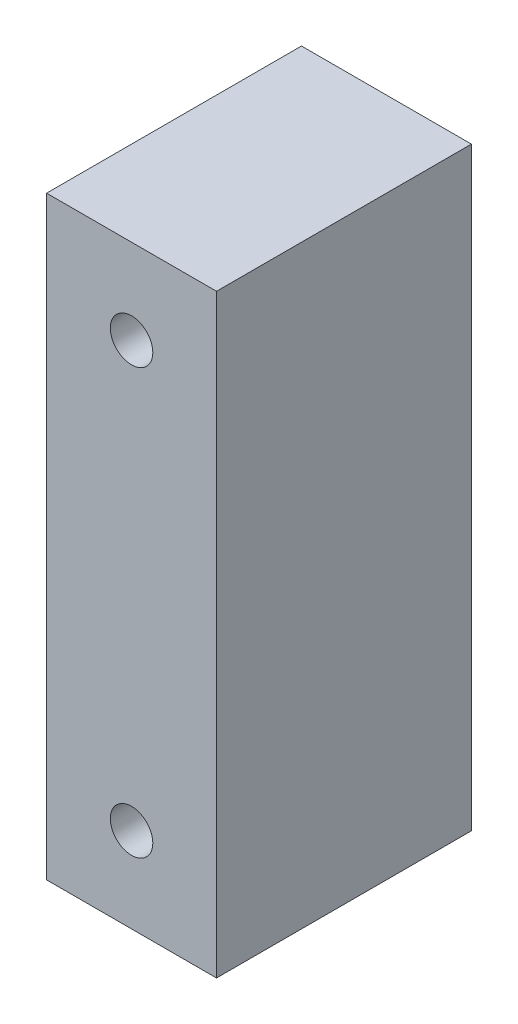
ISO-10303-21;
HEADER;
FILE_DESCRIPTION(('STEP AP214'),'2;1');
FILE_NAME('part.step','',(''),(''),'','','');
FILE_SCHEMA(('AUTOMOTIVE_DESIGN { 1 0 10303 214 1 1 1 1 }'));
ENDSEC;
DATA;
#1=APPLICATION_CONTEXT('core data for automotive mechanical design processes');
#2=APPLICATION_PROTOCOL_DEFINITION('international standard','automotive_design',2000,#1);
#3=PRODUCT_CONTEXT('',#1,'mechanical');
#4=PRODUCT('Part','Part','',(#3));
#5=PRODUCT_RELATED_PRODUCT_CATEGORY('part','',(#4));
#6=PRODUCT_DEFINITION_FORMATION('','',#4);
#7=PRODUCT_DEFINITION_CONTEXT('part definition',#1,'design');
#8=PRODUCT_DEFINITION('design','',#6,#7);
#9=PRODUCT_DEFINITION_SHAPE('','',#8);
#10=(LENGTH_UNIT() NAMED_UNIT(*) SI_UNIT(.MILLI.,.METRE.));
#11=(NAMED_UNIT(*) PLANE_ANGLE_UNIT() SI_UNIT($,.RADIAN.));
#12=(NAMED_UNIT(*) SI_UNIT($,.STERADIAN.) SOLID_ANGLE_UNIT());
#13=UNCERTAINTY_MEASURE_WITH_UNIT(LENGTH_MEASURE(1.E-05),#10,'distance_accuracy_value','');
#14=(GEOMETRIC_REPRESENTATION_CONTEXT(3) GLOBAL_UNCERTAINTY_ASSIGNED_CONTEXT((#13)) GLOBAL_UNIT_ASSIGNED_CONTEXT((#10,
#11,#12)) REPRESENTATION_CONTEXT('',''));
#15=CARTESIAN_POINT('',(0.,0.,0.));
#16=DIRECTION('',(0.,0.,1.));
#17=DIRECTION('',(1.,0.,0.));
#18=AXIS2_PLACEMENT_3D('',#15,#16,#17);
#19=CARTESIAN_POINT('',(-30.,-105.,90.));
#20=DIRECTION('',(1.,0.,0.));
#21=DIRECTION('',(0.,0.,-1.));
#22=AXIS2_PLACEMENT_3D('',#19,#20,#21);
#23=PLANE('',#22);
#24=DIRECTION('',(0.,-1.,0.));
#25=VECTOR('',#24,1.);
#26=CARTESIAN_POINT('',(-30.,-105.,0.));
#27=LINE('',#26,#25);
#28=CARTESIAN_POINT('',(-30.,105.,0.));
#29=VERTEX_POINT('',#28);
#30=CARTESIAN_POINT('',(-30.,-105.,0.));
#31=VERTEX_POINT('',#30);
#32=EDGE_CURVE('E102',#29,#31,#27,.T.);
#33=ORIENTED_EDGE('',*,*,#32,.T.);
#34=DIRECTION('',(0.,0.,-1.));
#35=VECTOR('',#34,1.);
#36=CARTESIAN_POINT('',(-30.,-105.,90.));
#37=LINE('',#36,#35);
#38=CARTESIAN_POINT('',(-30.,-105.,90.));
#39=VERTEX_POINT('',#38);
#40=EDGE_CURVE('E11',#39,#31,#37,.T.);
#41=ORIENTED_EDGE('',*,*,#40,.F.);
#42=DIRECTION('',(0.,-1.,0.));
#43=VECTOR('',#42,1.);
#44=CARTESIAN_POINT('',(-30.,-105.,90.));
#45=LINE('',#44,#43);
#46=CARTESIAN_POINT('',(-30.,105.,90.));
#47=VERTEX_POINT('',#46);
#48=EDGE_CURVE('E90',#47,#39,#45,.T.);
#49=ORIENTED_EDGE('',*,*,#48,.F.);
#50=DIRECTION('',(0.,0.,-1.));
#51=VECTOR('',#50,1.);
#52=CARTESIAN_POINT('',(-30.,105.,90.));
#53=LINE('',#52,#51);
#54=EDGE_CURVE('E98',#47,#29,#53,.T.);
#55=ORIENTED_EDGE('',*,*,#54,.T.);
#56=EDGE_LOOP('',(#33,#41,#49,#55));
#57=FACE_BOUND('',#56,.T.);
#58=ADVANCED_FACE('F39',(#57),#23,.F.);
#59=CARTESIAN_POINT('',(30.,-105.,90.));
#60=DIRECTION('',(0.,1.,0.));
#61=DIRECTION('',(0.,0.,1.));
#62=AXIS2_PLACEMENT_3D('',#59,#60,#61);
#63=PLANE('',#62);
#64=DIRECTION('',(1.,0.,0.));
#65=VECTOR('',#64,1.);
#66=CARTESIAN_POINT('',(30.,-105.,0.));
#67=LINE('',#66,#65);
#68=CARTESIAN_POINT('',(30.,-105.,0.));
#69=VERTEX_POINT('',#68);
#70=EDGE_CURVE('E94',#31,#69,#67,.T.);
#71=ORIENTED_EDGE('',*,*,#70,.T.);
#72=DIRECTION('',(0.,0.,-1.));
#73=VECTOR('',#72,1.);
#74=CARTESIAN_POINT('',(30.,-105.,90.));
#75=LINE('',#74,#73);
#76=CARTESIAN_POINT('',(30.,-105.,90.));
#77=VERTEX_POINT('',#76);
#78=EDGE_CURVE('E47',#77,#69,#75,.T.);
#79=ORIENTED_EDGE('',*,*,#78,.F.);
#80=DIRECTION('',(1.,0.,0.));
#81=VECTOR('',#80,1.);
#82=CARTESIAN_POINT('',(30.,-105.,90.));
#83=LINE('',#82,#81);
#84=EDGE_CURVE('E85',#39,#77,#83,.T.);
#85=ORIENTED_EDGE('',*,*,#84,.F.);
#86=ORIENTED_EDGE('',*,*,#40,.T.);
#87=EDGE_LOOP('',(#71,#79,#85,#86));
#88=FACE_BOUND('',#87,.T.);
#89=ADVANCED_FACE('F93',(#88),#63,.F.);
#90=CARTESIAN_POINT('',(30.,-105.,90.));
#91=DIRECTION('',(-1.,0.,0.));
#92=DIRECTION('',(0.,0.,1.));
#93=AXIS2_PLACEMENT_3D('',#90,#91,#92);
#94=PLANE('',#93);
#95=DIRECTION('',(0.,1.,0.));
#96=VECTOR('',#95,1.);
#97=CARTESIAN_POINT('',(30.,-105.,0.));
#98=LINE('',#97,#96);
#99=CARTESIAN_POINT('',(30.,105.,0.));
#100=VERTEX_POINT('',#99);
#101=EDGE_CURVE('E72',#69,#100,#98,.T.);
#102=ORIENTED_EDGE('',*,*,#101,.T.);
#103=DIRECTION('',(0.,0.,-1.));
#104=VECTOR('',#103,1.);
#105=CARTESIAN_POINT('',(30.,105.,90.));
#106=LINE('',#105,#104);
#107=CARTESIAN_POINT('',(30.,105.,90.));
#108=VERTEX_POINT('',#107);
#109=EDGE_CURVE('E95',#108,#100,#106,.T.);
#110=ORIENTED_EDGE('',*,*,#109,.F.);
#111=DIRECTION('',(0.,1.,0.));
#112=VECTOR('',#111,1.);
#113=CARTESIAN_POINT('',(30.,-105.,90.));
#114=LINE('',#113,#112);
#115=EDGE_CURVE('E88',#77,#108,#114,.T.);
#116=ORIENTED_EDGE('',*,*,#115,.F.);
#117=ORIENTED_EDGE('',*,*,#78,.T.);
#118=EDGE_LOOP('',(#102,#110,#116,#117));
#119=FACE_BOUND('',#118,.T.);
#120=ADVANCED_FACE('F96',(#119),#94,.F.);
#121=CARTESIAN_POINT('',(30.,105.,90.));
#122=DIRECTION('',(0.,-1.,0.));
#123=DIRECTION('',(1.,0.,0.));
#124=AXIS2_PLACEMENT_3D('',#121,#122,#123);
#125=PLANE('',#124);
#126=DIRECTION('',(-1.,0.,0.));
#127=VECTOR('',#126,1.);
#128=CARTESIAN_POINT('',(30.,105.,0.));
#129=LINE('',#128,#127);
#130=EDGE_CURVE('E78',#100,#29,#129,.T.);
#131=ORIENTED_EDGE('',*,*,#130,.T.);
#132=ORIENTED_EDGE('',*,*,#54,.F.);
#133=DIRECTION('',(-1.,0.,0.));
#134=VECTOR('',#133,1.);
#135=CARTESIAN_POINT('',(30.,105.,90.));
#136=LINE('',#135,#134);
#137=EDGE_CURVE('E55',#108,#47,#136,.T.);
#138=ORIENTED_EDGE('',*,*,#137,.F.);
#139=ORIENTED_EDGE('',*,*,#109,.T.);
#140=EDGE_LOOP('',(#131,#132,#138,#139));
#141=FACE_BOUND('',#140,.T.);
#142=ADVANCED_FACE('F110',(#141),#125,.F.);
#143=CARTESIAN_POINT('',(0.,0.,90.));
#144=DIRECTION('',(0.,0.,1.));
#145=DIRECTION('',(1.,0.,0.));
#146=AXIS2_PLACEMENT_3D('',#143,#144,#145);
#147=PLANE('',#146);
#148=CARTESIAN_POINT('',(0.,75.,90.));
#149=DIRECTION('',(0.,0.,1.));
#150=DIRECTION('',(1.,0.,0.));
#151=AXIS2_PLACEMENT_3D('',#148,#149,#150);
#152=CIRCLE('',#151,7.5);
#153=CARTESIAN_POINT('',(7.5,75.,90.));
#154=VERTEX_POINT('',#153);
#155=EDGE_CURVE('E119',#154,#154,#152,.T.);
#156=ORIENTED_EDGE('',*,*,#155,.F.);
#157=EDGE_LOOP('',(#156));
#158=FACE_BOUND('',#157,.T.);
#159=CARTESIAN_POINT('',(0.,-75.,90.));
#160=DIRECTION('',(0.,0.,1.));
#161=DIRECTION('',(1.,0.,0.));
#162=AXIS2_PLACEMENT_3D('',#159,#160,#161);
#163=CIRCLE('',#162,7.5);
#164=CARTESIAN_POINT('',(7.5,-75.,90.));
#165=VERTEX_POINT('',#164);
#166=EDGE_CURVE('E116',#165,#165,#163,.T.);
#167=ORIENTED_EDGE('',*,*,#166,.F.);
#168=EDGE_LOOP('',(#167));
#169=FACE_BOUND('',#168,.T.);
#170=ORIENTED_EDGE('',*,*,#48,.T.);
#171=ORIENTED_EDGE('',*,*,#84,.T.);
#172=ORIENTED_EDGE('',*,*,#115,.T.);
#173=ORIENTED_EDGE('',*,*,#137,.T.);
#174=EDGE_LOOP('',(#170,#171,#172,#173));
#175=FACE_BOUND('',#174,.T.);
#176=ADVANCED_FACE('F86',(#158,#169,#175),#147,.T.);
#177=CARTESIAN_POINT('',(0.,0.,0.));
#178=DIRECTION('',(0.,0.,1.));
#179=DIRECTION('',(1.,0.,0.));
#180=AXIS2_PLACEMENT_3D('',#177,#178,#179);
#181=PLANE('',#180);
#182=CARTESIAN_POINT('',(0.,75.,0.));
#183=DIRECTION('',(0.,0.,1.));
#184=DIRECTION('',(1.,0.,0.));
#185=AXIS2_PLACEMENT_3D('',#182,#183,#184);
#186=CIRCLE('',#185,7.5);
#187=CARTESIAN_POINT('',(7.5,75.,0.));
#188=VERTEX_POINT('',#187);
#189=EDGE_CURVE('E105',#188,#188,#186,.F.);
#190=ORIENTED_EDGE('',*,*,#189,.F.);
#191=EDGE_LOOP('',(#190));
#192=FACE_BOUND('',#191,.T.);
#193=CARTESIAN_POINT('',(0.,-75.,0.));
#194=DIRECTION('',(0.,0.,1.));
#195=DIRECTION('',(1.,0.,0.));
#196=AXIS2_PLACEMENT_3D('',#193,#194,#195);
#197=CIRCLE('',#196,7.5);
#198=CARTESIAN_POINT('',(7.5,-75.,0.));
#199=VERTEX_POINT('',#198);
#200=EDGE_CURVE('E120',#199,#199,#197,.F.);
#201=ORIENTED_EDGE('',*,*,#200,.F.);
#202=EDGE_LOOP('',(#201));
#203=FACE_BOUND('',#202,.T.);
#204=ORIENTED_EDGE('',*,*,#32,.F.);
#205=ORIENTED_EDGE('',*,*,#130,.F.);
#206=ORIENTED_EDGE('',*,*,#101,.F.);
#207=ORIENTED_EDGE('',*,*,#70,.F.);
#208=EDGE_LOOP('',(#204,#205,#206,#207));
#209=FACE_BOUND('',#208,.T.);
#210=ADVANCED_FACE('F113',(#192,#203,#209),#181,.F.);
#211=CARTESIAN_POINT('',(0.,-75.,-0.001000000000001));
#212=DIRECTION('',(0.,0.,1.));
#213=DIRECTION('',(1.,0.,0.));
#214=AXIS2_PLACEMENT_3D('',#211,#212,#213);
#215=CYLINDRICAL_SURFACE('',#214,7.5);
#216=CARTESIAN_POINT('',(7.5,-75.,90.));
#217=CARTESIAN_POINT('',(7.5,-75.,89.0625));
#218=CARTESIAN_POINT('',(7.5,-75.,88.125));
#219=CARTESIAN_POINT('',(7.5,-75.,86.25));
#220=CARTESIAN_POINT('',(7.5,-75.,85.3125));
#221=CARTESIAN_POINT('',(7.5,-75.,83.4375));
#222=CARTESIAN_POINT('',(7.5,-75.,82.5));
#223=CARTESIAN_POINT('',(7.5,-75.,80.625));
#224=CARTESIAN_POINT('',(7.5,-75.,79.6875));
#225=CARTESIAN_POINT('',(7.5,-75.,77.8125));
#226=CARTESIAN_POINT('',(7.5,-75.,76.875));
#227=CARTESIAN_POINT('',(7.5,-75.,75.));
#228=CARTESIAN_POINT('',(7.5,-75.,74.0625));
#229=CARTESIAN_POINT('',(7.5,-75.,72.1875));
#230=CARTESIAN_POINT('',(7.5,-75.,71.25));
#231=CARTESIAN_POINT('',(7.5,-75.,69.375));
#232=CARTESIAN_POINT('',(7.5,-75.,68.4375));
#233=CARTESIAN_POINT('',(7.5,-75.,66.5625));
#234=CARTESIAN_POINT('',(7.5,-75.,65.625));
#235=CARTESIAN_POINT('',(7.5,-75.,63.75));
#236=CARTESIAN_POINT('',(7.5,-75.,62.8125));
#237=CARTESIAN_POINT('',(7.5,-75.,60.9375));
#238=CARTESIAN_POINT('',(7.5,-75.,60.));
#239=CARTESIAN_POINT('',(7.5,-75.,58.125));
#240=CARTESIAN_POINT('',(7.5,-75.,57.1875));
#241=CARTESIAN_POINT('',(7.5,-75.,55.3125));
#242=CARTESIAN_POINT('',(7.5,-75.,54.375));
#243=CARTESIAN_POINT('',(7.5,-75.,52.5));
#244=CARTESIAN_POINT('',(7.5,-75.,51.5625));
#245=CARTESIAN_POINT('',(7.5,-75.,49.6875));
#246=CARTESIAN_POINT('',(7.5,-75.,48.75));
#247=CARTESIAN_POINT('',(7.5,-75.,46.875));
#248=CARTESIAN_POINT('',(7.5,-75.,45.9375));
#249=CARTESIAN_POINT('',(7.5,-75.,44.0625));
#250=CARTESIAN_POINT('',(7.5,-75.,43.125));
#251=CARTESIAN_POINT('',(7.5,-75.,41.25));
#252=CARTESIAN_POINT('',(7.5,-75.,40.3125));
#253=CARTESIAN_POINT('',(7.5,-75.,38.4375));
#254=CARTESIAN_POINT('',(7.5,-75.,37.5));
#255=CARTESIAN_POINT('',(7.5,-75.,35.625));
#256=CARTESIAN_POINT('',(7.5,-75.,34.6875));
#257=CARTESIAN_POINT('',(7.5,-75.,32.8125));
#258=CARTESIAN_POINT('',(7.5,-75.,31.875));
#259=CARTESIAN_POINT('',(7.5,-75.,30.));
#260=CARTESIAN_POINT('',(7.5,-75.,29.0625));
#261=CARTESIAN_POINT('',(7.5,-75.,27.1875));
#262=CARTESIAN_POINT('',(7.5,-75.,26.25));
#263=CARTESIAN_POINT('',(7.5,-75.,24.375));
#264=CARTESIAN_POINT('',(7.5,-75.,23.4375));
#265=CARTESIAN_POINT('',(7.5,-75.,21.5625));
#266=CARTESIAN_POINT('',(7.5,-75.,20.625));
#267=CARTESIAN_POINT('',(7.5,-75.,18.75));
#268=CARTESIAN_POINT('',(7.5,-75.,17.8125));
#269=CARTESIAN_POINT('',(7.5,-75.,15.9375));
#270=CARTESIAN_POINT('',(7.5,-75.,15.));
#271=CARTESIAN_POINT('',(7.5,-75.,13.125));
#272=CARTESIAN_POINT('',(7.5,-75.,12.1875));
#273=CARTESIAN_POINT('',(7.5,-75.,10.3125));
#274=CARTESIAN_POINT('',(7.5,-75.,9.375));
#275=CARTESIAN_POINT('',(7.5,-75.,7.5));
#276=CARTESIAN_POINT('',(7.5,-75.,6.5625));
#277=CARTESIAN_POINT('',(7.5,-75.,4.6875));
#278=CARTESIAN_POINT('',(7.5,-75.,3.75));
#279=CARTESIAN_POINT('',(7.5,-75.,1.875));
#280=CARTESIAN_POINT('',(7.5,-75.,0.9375));
#281=CARTESIAN_POINT('',(7.5,-75.,0.));
#282=B_SPLINE_CURVE_WITH_KNOTS('',3,(#216,#217,#218,#219,#220,#221,#222,#223,#224,#225,#226,
#227,#228,#229,#230,#231,#232,#233,#234,#235,#236,#237,#238,#239,#240,#241,#242,#243,#244,#245,
#246,#247,#248,#249,#250,#251,#252,#253,#254,#255,#256,#257,#258,#259,#260,#261,#262,#263,#264,
#265,#266,#267,#268,#269,#270,#271,#272,#273,#274,#275,#276,#277,#278,#279,#280,#281),
.UNSPECIFIED.,.F.,.F.,(4,2,2,2,2,2,2,2,2,2,2,2,2,2,2,2,2,2,2,2,2,2,2,2,2,2,2,2,2,2,2,2,4),(0.,
2.8125,5.62500000000001,8.4375,11.25,14.0625,16.875,19.6875,22.5,25.3125,28.125,30.9375,33.75,
36.5625,39.375,42.1875,45.,47.8125,50.625,53.4375,56.25,59.0625,61.875,64.6875,67.5,70.3125,
73.125,75.9375,78.75,81.5625,84.375,87.1875,90.),.UNSPECIFIED.);
#283=EDGE_CURVE('BSEAM136',#165,#199,#282,.T.);
#284=ORIENTED_EDGE('',*,*,#166,.T.);
#285=ORIENTED_EDGE('',*,*,#200,.T.);
#286=ORIENTED_EDGE('',*,*,#283,.T.);
#287=ORIENTED_EDGE('',*,*,#283,.F.);
#288=EDGE_LOOP('',(#284,#286,#285,#287));
#289=FACE_BOUND('',#288,.T.);
#290=ADVANCED_FACE('F136',(#289),#215,.F.);
#291=CARTESIAN_POINT('',(0.,75.,-0.001000000000001));
#292=DIRECTION('',(0.,0.,1.));
#293=DIRECTION('',(1.,0.,0.));
#294=AXIS2_PLACEMENT_3D('',#291,#292,#293);
#295=CYLINDRICAL_SURFACE('',#294,7.5);
#296=CARTESIAN_POINT('',(7.5,75.,90.));
#297=CARTESIAN_POINT('',(7.5,75.,89.0625));
#298=CARTESIAN_POINT('',(7.5,75.,88.125));
#299=CARTESIAN_POINT('',(7.5,75.,86.25));
#300=CARTESIAN_POINT('',(7.5,75.,85.3125));
#301=CARTESIAN_POINT('',(7.5,75.,83.4375));
#302=CARTESIAN_POINT('',(7.5,75.,82.5));
#303=CARTESIAN_POINT('',(7.5,75.,80.625));
#304=CARTESIAN_POINT('',(7.5,75.,79.6875));
#305=CARTESIAN_POINT('',(7.5,75.,77.8125));
#306=CARTESIAN_POINT('',(7.5,75.,76.875));
#307=CARTESIAN_POINT('',(7.5,75.,75.));
#308=CARTESIAN_POINT('',(7.5,75.,74.0625));
#309=CARTESIAN_POINT('',(7.5,75.,72.1875));
#310=CARTESIAN_POINT('',(7.5,75.,71.25));
#311=CARTESIAN_POINT('',(7.5,75.,69.375));
#312=CARTESIAN_POINT('',(7.5,75.,68.4375));
#313=CARTESIAN_POINT('',(7.5,75.,66.5625));
#314=CARTESIAN_POINT('',(7.5,75.,65.625));
#315=CARTESIAN_POINT('',(7.5,75.,63.75));
#316=CARTESIAN_POINT('',(7.5,75.,62.8125));
#317=CARTESIAN_POINT('',(7.5,75.,60.9375));
#318=CARTESIAN_POINT('',(7.5,75.,60.));
#319=CARTESIAN_POINT('',(7.5,75.,58.125));
#320=CARTESIAN_POINT('',(7.5,75.,57.1875));
#321=CARTESIAN_POINT('',(7.5,75.,55.3125));
#322=CARTESIAN_POINT('',(7.5,75.,54.375));
#323=CARTESIAN_POINT('',(7.5,75.,52.5));
#324=CARTESIAN_POINT('',(7.5,75.,51.5625));
#325=CARTESIAN_POINT('',(7.5,75.,49.6875));
#326=CARTESIAN_POINT('',(7.5,75.,48.75));
#327=CARTESIAN_POINT('',(7.5,75.,46.875));
#328=CARTESIAN_POINT('',(7.5,75.,45.9375));
#329=CARTESIAN_POINT('',(7.5,75.,44.0625));
#330=CARTESIAN_POINT('',(7.5,75.,43.125));
#331=CARTESIAN_POINT('',(7.5,75.,41.25));
#332=CARTESIAN_POINT('',(7.5,75.,40.3125));
#333=CARTESIAN_POINT('',(7.5,75.,38.4375));
#334=CARTESIAN_POINT('',(7.5,75.,37.5));
#335=CARTESIAN_POINT('',(7.5,75.,35.625));
#336=CARTESIAN_POINT('',(7.5,75.,34.6875));
#337=CARTESIAN_POINT('',(7.5,75.,32.8125));
#338=CARTESIAN_POINT('',(7.5,75.,31.875));
#339=CARTESIAN_POINT('',(7.5,75.,30.));
#340=CARTESIAN_POINT('',(7.5,75.,29.0625));
#341=CARTESIAN_POINT('',(7.5,75.,27.1875));
#342=CARTESIAN_POINT('',(7.5,75.,26.25));
#343=CARTESIAN_POINT('',(7.5,75.,24.375));
#344=CARTESIAN_POINT('',(7.5,75.,23.4375));
#345=CARTESIAN_POINT('',(7.5,75.,21.5625));
#346=CARTESIAN_POINT('',(7.5,75.,20.625));
#347=CARTESIAN_POINT('',(7.5,75.,18.75));
#348=CARTESIAN_POINT('',(7.5,75.,17.8125));
#349=CARTESIAN_POINT('',(7.5,75.,15.9375));
#350=CARTESIAN_POINT('',(7.5,75.,15.));
#351=CARTESIAN_POINT('',(7.5,75.,13.125));
#352=CARTESIAN_POINT('',(7.5,75.,12.1875));
#353=CARTESIAN_POINT('',(7.5,75.,10.3125));
#354=CARTESIAN_POINT('',(7.5,75.,9.375));
#355=CARTESIAN_POINT('',(7.5,75.,7.5));
#356=CARTESIAN_POINT('',(7.5,75.,6.5625));
#357=CARTESIAN_POINT('',(7.5,75.,4.6875));
#358=CARTESIAN_POINT('',(7.5,75.,3.75));
#359=CARTESIAN_POINT('',(7.5,75.,1.875));
#360=CARTESIAN_POINT('',(7.5,75.,0.9375));
#361=CARTESIAN_POINT('',(7.5,75.,0.));
#362=B_SPLINE_CURVE_WITH_KNOTS('',3,(#296,#297,#298,#299,#300,#301,#302,#303,#304,#305,#306,
#307,#308,#309,#310,#311,#312,#313,#314,#315,#316,#317,#318,#319,#320,#321,#322,#323,#324,#325,
#326,#327,#328,#329,#330,#331,#332,#333,#334,#335,#336,#337,#338,#339,#340,#341,#342,#343,#344,
#345,#346,#347,#348,#349,#350,#351,#352,#353,#354,#355,#356,#357,#358,#359,#360,#361),
.UNSPECIFIED.,.F.,.F.,(4,2,2,2,2,2,2,2,2,2,2,2,2,2,2,2,2,2,2,2,2,2,2,2,2,2,2,2,2,2,2,2,4),(0.,
2.8125,5.62500000000001,8.4375,11.25,14.0625,16.875,19.6875,22.5,25.3125,28.125,30.9375,33.75,
36.5625,39.375,42.1875,45.,47.8125,50.625,53.4375,56.25,59.0625,61.875,64.6875,67.5,70.3125,
73.125,75.9375,78.75,81.5625,84.375,87.1875,90.),.UNSPECIFIED.);
#363=EDGE_CURVE('BSEAM128',#154,#188,#362,.T.);
#364=ORIENTED_EDGE('',*,*,#155,.T.);
#365=ORIENTED_EDGE('',*,*,#189,.T.);
#366=ORIENTED_EDGE('',*,*,#363,.T.);
#367=ORIENTED_EDGE('',*,*,#363,.F.);
#368=EDGE_LOOP('',(#364,#366,#365,#367));
#369=FACE_BOUND('',#368,.T.);
#370=ADVANCED_FACE('F128',(#369),#295,.F.);
#371=CLOSED_SHELL('',(#58,#89,#120,#142,#176,#210,#290,#370));
#372=MANIFOLD_SOLID_BREP('B2',#371);
#373=ADVANCED_BREP_SHAPE_REPRESENTATION('',(#18,#372),#14);
#374=SHAPE_DEFINITION_REPRESENTATION(#9,#373);
ENDSEC;
END-ISO-10303-21;
